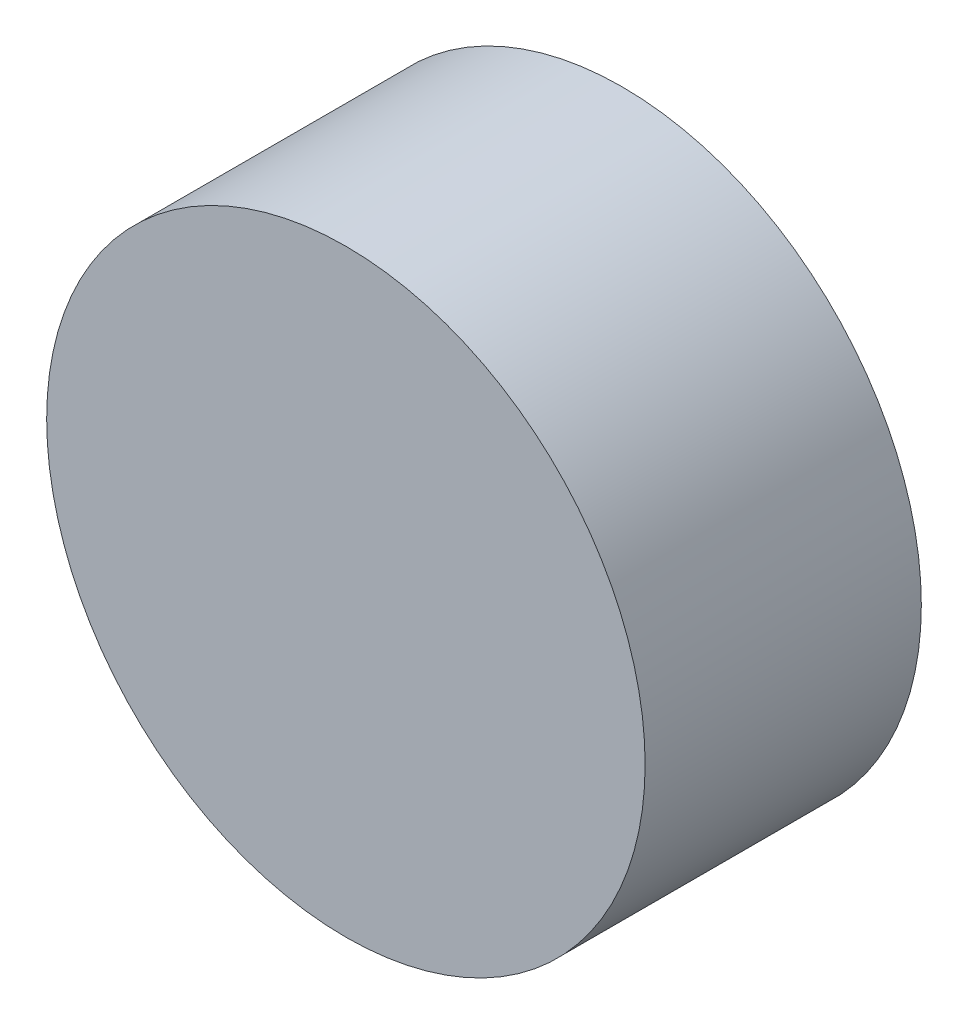
ISO-10303-21;
HEADER;
FILE_DESCRIPTION(('STEP AP214'),'2;1');
FILE_NAME('part.step','',(''),(''),'','','');
FILE_SCHEMA(('AUTOMOTIVE_DESIGN { 1 0 10303 214 1 1 1 1 }'));
ENDSEC;
DATA;
#1=APPLICATION_CONTEXT('core data for automotive mechanical design processes');
#2=APPLICATION_PROTOCOL_DEFINITION('international standard','automotive_design',2000,#1);
#3=PRODUCT_CONTEXT('',#1,'mechanical');
#4=PRODUCT('Part','Part','',(#3));
#5=PRODUCT_RELATED_PRODUCT_CATEGORY('part','',(#4));
#6=PRODUCT_DEFINITION_FORMATION('','',#4);
#7=PRODUCT_DEFINITION_CONTEXT('part definition',#1,'design');
#8=PRODUCT_DEFINITION('design','',#6,#7);
#9=PRODUCT_DEFINITION_SHAPE('','',#8);
#10=(LENGTH_UNIT() NAMED_UNIT(*) SI_UNIT(.MILLI.,.METRE.));
#11=(NAMED_UNIT(*) PLANE_ANGLE_UNIT() SI_UNIT($,.RADIAN.));
#12=(NAMED_UNIT(*) SI_UNIT($,.STERADIAN.) SOLID_ANGLE_UNIT());
#13=UNCERTAINTY_MEASURE_WITH_UNIT(LENGTH_MEASURE(1.E-05),#10,'distance_accuracy_value','');
#14=(GEOMETRIC_REPRESENTATION_CONTEXT(3) GLOBAL_UNCERTAINTY_ASSIGNED_CONTEXT((#13)) GLOBAL_UNIT_ASSIGNED_CONTEXT((#10,
#11,#12)) REPRESENTATION_CONTEXT('',''));
#15=CARTESIAN_POINT('',(0.,0.,0.));
#16=DIRECTION('',(0.,0.,1.));
#17=DIRECTION('',(1.,0.,0.));
#18=AXIS2_PLACEMENT_3D('',#15,#16,#17);
#19=CARTESIAN_POINT('',(0.,0.,3.));
#20=DIRECTION('',(0.,0.,-1.));
#21=DIRECTION('',(-1.,0.,0.));
#22=AXIS2_PLACEMENT_3D('',#19,#20,#21);
#23=CYLINDRICAL_SURFACE('',#22,3.25);
#24=CARTESIAN_POINT('',(0.,0.,3.));
#25=DIRECTION('',(0.,0.,1.));
#26=DIRECTION('',(1.,0.,0.));
#27=AXIS2_PLACEMENT_3D('',#24,#25,#26);
#28=CIRCLE('',#27,3.25);
#29=CARTESIAN_POINT('',(3.25,0.,3.));
#30=VERTEX_POINT('',#29);
#31=EDGE_CURVE('E10',#30,#30,#28,.T.);
#32=ORIENTED_EDGE('',*,*,#31,.F.);
#33=EDGE_LOOP('',(#32));
#34=FACE_BOUND('',#33,.T.);
#35=CARTESIAN_POINT('',(0.,0.,0.));
#36=DIRECTION('',(0.,0.,1.));
#37=DIRECTION('',(1.,0.,0.));
#38=AXIS2_PLACEMENT_3D('',#35,#36,#37);
#39=CIRCLE('',#38,3.25);
#40=CARTESIAN_POINT('',(3.25,0.,0.));
#41=VERTEX_POINT('',#40);
#42=EDGE_CURVE('E46',#41,#41,#39,.T.);
#43=ORIENTED_EDGE('',*,*,#42,.T.);
#44=EDGE_LOOP('',(#43));
#45=FACE_BOUND('',#44,.T.);
#46=ADVANCED_FACE('F43',(#34,#45),#23,.T.);
#47=CARTESIAN_POINT('',(0.,0.,3.));
#48=DIRECTION('',(0.,0.,1.));
#49=DIRECTION('',(1.,0.,0.));
#50=AXIS2_PLACEMENT_3D('',#47,#48,#49);
#51=PLANE('',#50);
#52=ORIENTED_EDGE('',*,*,#31,.T.);
#53=EDGE_LOOP('',(#52));
#54=FACE_BOUND('',#53,.T.);
#55=ADVANCED_FACE('F60',(#54),#51,.T.);
#56=CARTESIAN_POINT('',(0.,0.,0.));
#57=DIRECTION('',(0.,0.,1.));
#58=DIRECTION('',(1.,0.,0.));
#59=AXIS2_PLACEMENT_3D('',#56,#57,#58);
#60=PLANE('',#59);
#61=ORIENTED_EDGE('',*,*,#42,.F.);
#62=EDGE_LOOP('',(#61));
#63=FACE_BOUND('',#62,.T.);
#64=ADVANCED_FACE('F58',(#63),#60,.F.);
#65=CLOSED_SHELL('',(#46,#55,#64));
#66=MANIFOLD_SOLID_BREP('B2',#65);
#67=ADVANCED_BREP_SHAPE_REPRESENTATION('',(#18,#66),#14);
#68=SHAPE_DEFINITION_REPRESENTATION(#9,#67);
ENDSEC;
END-ISO-10303-21;
